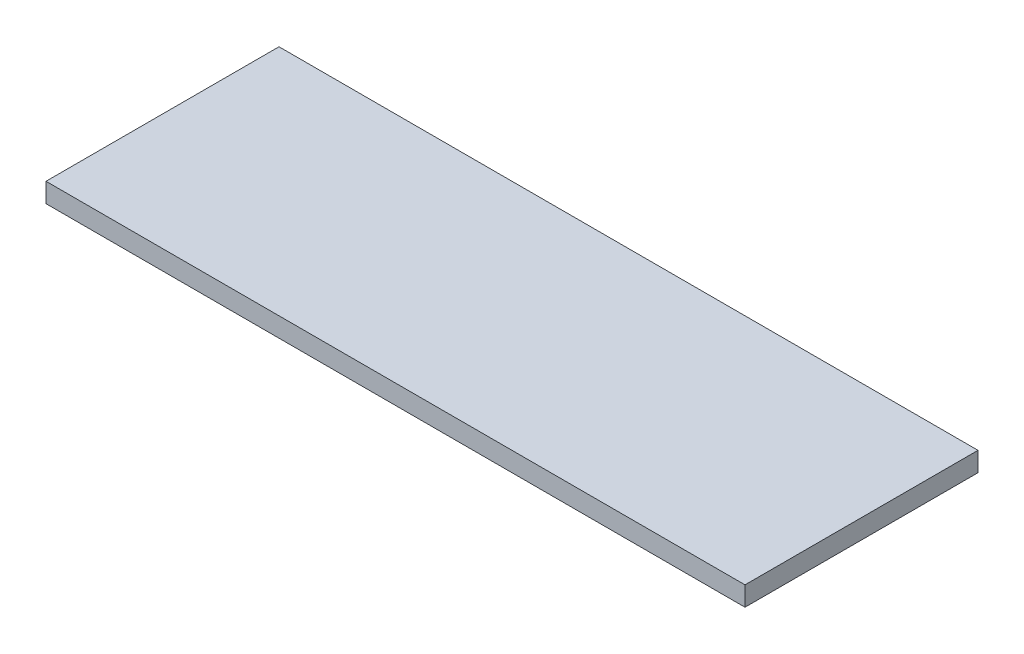
ISO-10303-21;
HEADER;
FILE_DESCRIPTION(('STEP AP214'),'2;1');
FILE_NAME('part.step','',(''),(''),'','','');
FILE_SCHEMA(('AUTOMOTIVE_DESIGN { 1 0 10303 214 1 1 1 1 }'));
ENDSEC;
DATA;
#1=APPLICATION_CONTEXT('core data for automotive mechanical design processes');
#2=APPLICATION_PROTOCOL_DEFINITION('international standard','automotive_design',2000,#1);
#3=PRODUCT_CONTEXT('',#1,'mechanical');
#4=PRODUCT('Part','Part','',(#3));
#5=PRODUCT_RELATED_PRODUCT_CATEGORY('part','',(#4));
#6=PRODUCT_DEFINITION_FORMATION('','',#4);
#7=PRODUCT_DEFINITION_CONTEXT('part definition',#1,'design');
#8=PRODUCT_DEFINITION('design','',#6,#7);
#9=PRODUCT_DEFINITION_SHAPE('','',#8);
#10=(LENGTH_UNIT() NAMED_UNIT(*) SI_UNIT(.MILLI.,.METRE.));
#11=(NAMED_UNIT(*) PLANE_ANGLE_UNIT() SI_UNIT($,.RADIAN.));
#12=(NAMED_UNIT(*) SI_UNIT($,.STERADIAN.) SOLID_ANGLE_UNIT());
#13=UNCERTAINTY_MEASURE_WITH_UNIT(LENGTH_MEASURE(1.E-05),#10,'distance_accuracy_value','');
#14=(GEOMETRIC_REPRESENTATION_CONTEXT(3) GLOBAL_UNCERTAINTY_ASSIGNED_CONTEXT((#13)) GLOBAL_UNIT_ASSIGNED_CONTEXT((#10,
#11,#12)) REPRESENTATION_CONTEXT('',''));
#15=CARTESIAN_POINT('',(0.,0.,0.));
#16=DIRECTION('',(0.,0.,1.));
#17=DIRECTION('',(1.,0.,0.));
#18=AXIS2_PLACEMENT_3D('',#15,#16,#17);
#19=CARTESIAN_POINT('',(457.2,25.4,152.4));
#20=DIRECTION('',(-1.,0.,0.));
#21=DIRECTION('',(0.,0.,1.));
#22=AXIS2_PLACEMENT_3D('',#19,#20,#21);
#23=PLANE('',#22);
#24=DIRECTION('',(0.,0.,-1.));
#25=VECTOR('',#24,1.);
#26=CARTESIAN_POINT('',(457.2,0.,152.4));
#27=LINE('',#26,#25);
#28=CARTESIAN_POINT('',(457.2,0.,152.4));
#29=VERTEX_POINT('',#28);
#30=CARTESIAN_POINT('',(457.2,0.,-152.4));
#31=VERTEX_POINT('',#30);
#32=EDGE_CURVE('E96',#29,#31,#27,.T.);
#33=ORIENTED_EDGE('',*,*,#32,.T.);
#34=DIRECTION('',(0.,-1.,0.));
#35=VECTOR('',#34,1.);
#36=CARTESIAN_POINT('',(457.2,25.4,-152.4));
#37=LINE('',#36,#35);
#38=CARTESIAN_POINT('',(457.2,25.4,-152.4));
#39=VERTEX_POINT('',#38);
#40=EDGE_CURVE('E11',#39,#31,#37,.T.);
#41=ORIENTED_EDGE('',*,*,#40,.F.);
#42=DIRECTION('',(0.,0.,-1.));
#43=VECTOR('',#42,1.);
#44=CARTESIAN_POINT('',(457.2,25.4,152.4));
#45=LINE('',#44,#43);
#46=CARTESIAN_POINT('',(457.2,25.4,152.4));
#47=VERTEX_POINT('',#46);
#48=EDGE_CURVE('E84',#47,#39,#45,.T.);
#49=ORIENTED_EDGE('',*,*,#48,.F.);
#50=DIRECTION('',(0.,-1.,0.));
#51=VECTOR('',#50,1.);
#52=CARTESIAN_POINT('',(457.2,25.4,152.4));
#53=LINE('',#52,#51);
#54=EDGE_CURVE('E92',#47,#29,#53,.T.);
#55=ORIENTED_EDGE('',*,*,#54,.T.);
#56=EDGE_LOOP('',(#33,#41,#49,#55));
#57=FACE_BOUND('',#56,.T.);
#58=ADVANCED_FACE('F33',(#57),#23,.F.);
#59=CARTESIAN_POINT('',(-457.2,25.4,-152.4));
#60=DIRECTION('',(0.,0.,1.));
#61=DIRECTION('',(1.,0.,0.));
#62=AXIS2_PLACEMENT_3D('',#59,#60,#61);
#63=PLANE('',#62);
#64=DIRECTION('',(-1.,0.,0.));
#65=VECTOR('',#64,1.);
#66=CARTESIAN_POINT('',(-457.2,0.,-152.4));
#67=LINE('',#66,#65);
#68=CARTESIAN_POINT('',(-457.2,0.,-152.4));
#69=VERTEX_POINT('',#68);
#70=EDGE_CURVE('E88',#31,#69,#67,.T.);
#71=ORIENTED_EDGE('',*,*,#70,.T.);
#72=DIRECTION('',(0.,-1.,0.));
#73=VECTOR('',#72,1.);
#74=CARTESIAN_POINT('',(-457.2,25.4,-152.4));
#75=LINE('',#74,#73);
#76=CARTESIAN_POINT('',(-457.2,25.4,-152.4));
#77=VERTEX_POINT('',#76);
#78=EDGE_CURVE('E41',#77,#69,#75,.T.);
#79=ORIENTED_EDGE('',*,*,#78,.F.);
#80=DIRECTION('',(-1.,0.,0.));
#81=VECTOR('',#80,1.);
#82=CARTESIAN_POINT('',(-457.2,25.4,-152.4));
#83=LINE('',#82,#81);
#84=EDGE_CURVE('E79',#39,#77,#83,.T.);
#85=ORIENTED_EDGE('',*,*,#84,.F.);
#86=ORIENTED_EDGE('',*,*,#40,.T.);
#87=EDGE_LOOP('',(#71,#79,#85,#86));
#88=FACE_BOUND('',#87,.T.);
#89=ADVANCED_FACE('F87',(#88),#63,.F.);
#90=CARTESIAN_POINT('',(-457.2,25.4,152.4));
#91=DIRECTION('',(1.,0.,0.));
#92=DIRECTION('',(0.,0.,-1.));
#93=AXIS2_PLACEMENT_3D('',#90,#91,#92);
#94=PLANE('',#93);
#95=DIRECTION('',(0.,0.,1.));
#96=VECTOR('',#95,1.);
#97=CARTESIAN_POINT('',(-457.2,0.,152.4));
#98=LINE('',#97,#96);
#99=CARTESIAN_POINT('',(-457.2,0.,152.4));
#100=VERTEX_POINT('',#99);
#101=EDGE_CURVE('E66',#69,#100,#98,.T.);
#102=ORIENTED_EDGE('',*,*,#101,.T.);
#103=DIRECTION('',(0.,-1.,0.));
#104=VECTOR('',#103,1.);
#105=CARTESIAN_POINT('',(-457.2,25.4,152.4));
#106=LINE('',#105,#104);
#107=CARTESIAN_POINT('',(-457.2,25.4,152.4));
#108=VERTEX_POINT('',#107);
#109=EDGE_CURVE('E89',#108,#100,#106,.T.);
#110=ORIENTED_EDGE('',*,*,#109,.F.);
#111=DIRECTION('',(0.,0.,1.));
#112=VECTOR('',#111,1.);
#113=CARTESIAN_POINT('',(-457.2,25.4,152.4));
#114=LINE('',#113,#112);
#115=EDGE_CURVE('E82',#77,#108,#114,.T.);
#116=ORIENTED_EDGE('',*,*,#115,.F.);
#117=ORIENTED_EDGE('',*,*,#78,.T.);
#118=EDGE_LOOP('',(#102,#110,#116,#117));
#119=FACE_BOUND('',#118,.T.);
#120=ADVANCED_FACE('F90',(#119),#94,.F.);
#121=CARTESIAN_POINT('',(-457.2,25.4,152.4));
#122=DIRECTION('',(0.,0.,-1.));
#123=DIRECTION('',(-1.,0.,0.));
#124=AXIS2_PLACEMENT_3D('',#121,#122,#123);
#125=PLANE('',#124);
#126=DIRECTION('',(1.,0.,0.));
#127=VECTOR('',#126,1.);
#128=CARTESIAN_POINT('',(-457.2,0.,152.4));
#129=LINE('',#128,#127);
#130=EDGE_CURVE('E72',#100,#29,#129,.T.);
#131=ORIENTED_EDGE('',*,*,#130,.T.);
#132=ORIENTED_EDGE('',*,*,#54,.F.);
#133=DIRECTION('',(1.,0.,0.));
#134=VECTOR('',#133,1.);
#135=CARTESIAN_POINT('',(-457.2,25.4,152.4));
#136=LINE('',#135,#134);
#137=EDGE_CURVE('E49',#108,#47,#136,.T.);
#138=ORIENTED_EDGE('',*,*,#137,.F.);
#139=ORIENTED_EDGE('',*,*,#109,.T.);
#140=EDGE_LOOP('',(#131,#132,#138,#139));
#141=FACE_BOUND('',#140,.T.);
#142=ADVANCED_FACE('F103',(#141),#125,.F.);
#143=CARTESIAN_POINT('',(0.,25.4,0.));
#144=DIRECTION('',(0.,-1.,0.));
#145=DIRECTION('',(0.,0.,-1.));
#146=AXIS2_PLACEMENT_3D('',#143,#144,#145);
#147=PLANE('',#146);
#148=ORIENTED_EDGE('',*,*,#48,.T.);
#149=ORIENTED_EDGE('',*,*,#84,.T.);
#150=ORIENTED_EDGE('',*,*,#115,.T.);
#151=ORIENTED_EDGE('',*,*,#137,.T.);
#152=EDGE_LOOP('',(#148,#149,#150,#151));
#153=FACE_BOUND('',#152,.T.);
#154=ADVANCED_FACE('F80',(#153),#147,.F.);
#155=CARTESIAN_POINT('',(0.,0.,0.));
#156=DIRECTION('',(0.,-1.,0.));
#157=DIRECTION('',(0.,0.,-1.));
#158=AXIS2_PLACEMENT_3D('',#155,#156,#157);
#159=PLANE('',#158);
#160=ORIENTED_EDGE('',*,*,#32,.F.);
#161=ORIENTED_EDGE('',*,*,#130,.F.);
#162=ORIENTED_EDGE('',*,*,#101,.F.);
#163=ORIENTED_EDGE('',*,*,#70,.F.);
#164=EDGE_LOOP('',(#160,#161,#162,#163));
#165=FACE_BOUND('',#164,.T.);
#166=ADVANCED_FACE('F106',(#165),#159,.T.);
#167=CLOSED_SHELL('',(#58,#89,#120,#142,#154,#166));
#168=MANIFOLD_SOLID_BREP('B2',#167);
#169=ADVANCED_BREP_SHAPE_REPRESENTATION('',(#18,#168),#14);
#170=SHAPE_DEFINITION_REPRESENTATION(#9,#169);
ENDSEC;
END-ISO-10303-21;
